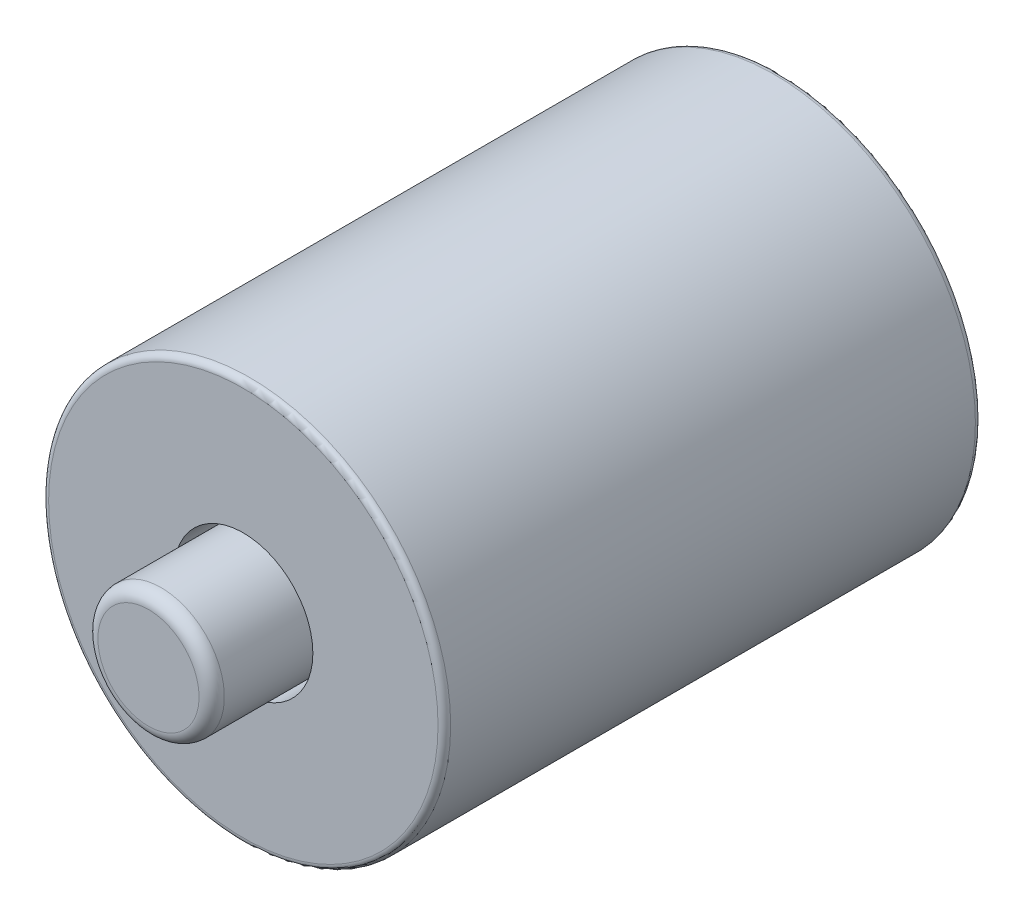
ISO-10303-21;
HEADER;
FILE_DESCRIPTION(('STEP AP214'),'2;1');
FILE_NAME('part.step','',(''),(''),'','','');
FILE_SCHEMA(('AUTOMOTIVE_DESIGN { 1 0 10303 214 1 1 1 1 }'));
ENDSEC;
DATA;
#1=APPLICATION_CONTEXT('core data for automotive mechanical design processes');
#2=APPLICATION_PROTOCOL_DEFINITION('international standard','automotive_design',2000,#1);
#3=PRODUCT_CONTEXT('',#1,'mechanical');
#4=PRODUCT('Part','Part','',(#3));
#5=PRODUCT_RELATED_PRODUCT_CATEGORY('part','',(#4));
#6=PRODUCT_DEFINITION_FORMATION('','',#4);
#7=PRODUCT_DEFINITION_CONTEXT('part definition',#1,'design');
#8=PRODUCT_DEFINITION('design','',#6,#7);
#9=PRODUCT_DEFINITION_SHAPE('','',#8);
#10=(LENGTH_UNIT() NAMED_UNIT(*) SI_UNIT(.MILLI.,.METRE.));
#11=(NAMED_UNIT(*) PLANE_ANGLE_UNIT() SI_UNIT($,.RADIAN.));
#12=(NAMED_UNIT(*) SI_UNIT($,.STERADIAN.) SOLID_ANGLE_UNIT());
#13=UNCERTAINTY_MEASURE_WITH_UNIT(LENGTH_MEASURE(1.E-05),#10,'distance_accuracy_value','');
#14=(GEOMETRIC_REPRESENTATION_CONTEXT(3) GLOBAL_UNCERTAINTY_ASSIGNED_CONTEXT((#13)) GLOBAL_UNIT_ASSIGNED_CONTEXT((#10,
#11,#12)) REPRESENTATION_CONTEXT('',''));
#15=CARTESIAN_POINT('',(0.,0.,0.));
#16=DIRECTION('',(0.,0.,1.));
#17=DIRECTION('',(1.,0.,0.));
#18=AXIS2_PLACEMENT_3D('',#15,#16,#17);
#19=CARTESIAN_POINT('',(0.,0.,10.));
#20=DIRECTION('',(0.,0.,-1.));
#21=DIRECTION('',(-1.,0.,0.));
#22=AXIS2_PLACEMENT_3D('',#19,#20,#21);
#23=CYLINDRICAL_SURFACE('',#22,1.);
#24=CARTESIAN_POINT('',(0.,0.,9.8));
#25=DIRECTION('',(0.,0.,-1.));
#26=DIRECTION('',(-1.,0.,0.));
#27=AXIS2_PLACEMENT_3D('',#24,#25,#26);
#28=CIRCLE('',#27,1.);
#29=CARTESIAN_POINT('',(-1.,0.,9.8));
#30=VERTEX_POINT('',#29);
#31=EDGE_CURVE('E45',#30,#30,#28,.T.);
#32=ORIENTED_EDGE('',*,*,#31,.T.);
#33=EDGE_LOOP('',(#32));
#34=FACE_BOUND('',#33,.T.);
#35=CARTESIAN_POINT('',(0.,0.,0.));
#36=DIRECTION('',(0.,0.,-1.));
#37=DIRECTION('',(-1.,0.,0.));
#38=AXIS2_PLACEMENT_3D('',#35,#36,#37);
#39=CIRCLE('',#38,1.);
#40=CARTESIAN_POINT('',(-1.,0.,0.));
#41=VERTEX_POINT('',#40);
#42=EDGE_CURVE('E49',#41,#41,#39,.T.);
#43=ORIENTED_EDGE('',*,*,#42,.F.);
#44=EDGE_LOOP('',(#43));
#45=FACE_BOUND('',#44,.T.);
#46=ADVANCED_FACE('F38',(#34,#45),#23,.T.);
#47=CARTESIAN_POINT('',(0.,0.,10.));
#48=DIRECTION('',(0.,0.,-1.));
#49=DIRECTION('',(-1.,0.,0.));
#50=AXIS2_PLACEMENT_3D('',#47,#48,#49);
#51=PLANE('',#50);
#52=CARTESIAN_POINT('',(0.,0.,10.));
#53=DIRECTION('',(0.,0.,-1.));
#54=DIRECTION('',(-1.,0.,0.));
#55=AXIS2_PLACEMENT_3D('',#52,#53,#54);
#56=CIRCLE('',#55,0.8);
#57=CARTESIAN_POINT('',(-0.8,0.,10.));
#58=VERTEX_POINT('',#57);
#59=EDGE_CURVE('E11',#58,#58,#56,.F.);
#60=ORIENTED_EDGE('',*,*,#59,.T.);
#61=EDGE_LOOP('',(#60));
#62=FACE_BOUND('',#61,.T.);
#63=ADVANCED_FACE('F59',(#62),#51,.F.);
#64=CARTESIAN_POINT('',(0.,0.,0.));
#65=DIRECTION('',(0.,0.,-1.));
#66=DIRECTION('',(-1.,0.,0.));
#67=AXIS2_PLACEMENT_3D('',#64,#65,#66);
#68=PLANE('',#67);
#69=ORIENTED_EDGE('',*,*,#42,.T.);
#70=EDGE_LOOP('',(#69));
#71=FACE_BOUND('',#70,.T.);
#72=ADVANCED_FACE('F56',(#71),#68,.T.);
#73=CARTESIAN_POINT('',(0.,0.,9.8));
#74=DIRECTION('',(0.,0.,-1.));
#75=DIRECTION('',(-1.,0.,0.));
#76=AXIS2_PLACEMENT_3D('',#73,#74,#75);
#77=TOROIDAL_SURFACE('',#76,0.8,0.2);
#78=ORIENTED_EDGE('',*,*,#59,.F.);
#79=EDGE_LOOP('',(#78));
#80=FACE_BOUND('',#79,.T.);
#81=ORIENTED_EDGE('',*,*,#31,.F.);
#82=EDGE_LOOP('',(#81));
#83=FACE_BOUND('',#82,.T.);
#84=ADVANCED_FACE('F40',(#80,#83),#77,.T.);
#85=CLOSED_SHELL('',(#46,#63,#72,#84));
#86=MANIFOLD_SOLID_BREP('B2',#85);
#87=CARTESIAN_POINT('',(0.,0.,8.5));
#88=DIRECTION('',(0.,0.,-1.));
#89=DIRECTION('',(-1.,0.,0.));
#90=AXIS2_PLACEMENT_3D('',#87,#88,#89);
#91=CYLINDRICAL_SURFACE('',#90,3.18);
#92=CARTESIAN_POINT('',(0.,0.,0.0999999999999994));
#93=DIRECTION('',(0.,0.,1.));
#94=DIRECTION('',(1.,0.,0.));
#95=AXIS2_PLACEMENT_3D('',#92,#93,#94);
#96=CIRCLE('',#95,3.18);
#97=CARTESIAN_POINT('',(3.18,0.,0.0999999999999994));
#98=VERTEX_POINT('',#97);
#99=EDGE_CURVE('E101',#98,#98,#96,.T.);
#100=ORIENTED_EDGE('',*,*,#99,.T.);
#101=EDGE_LOOP('',(#100));
#102=FACE_BOUND('',#101,.T.);
#103=CARTESIAN_POINT('',(0.,0.,8.4));
#104=DIRECTION('',(0.,0.,1.));
#105=DIRECTION('',(1.,0.,0.));
#106=AXIS2_PLACEMENT_3D('',#103,#104,#105);
#107=CIRCLE('',#106,3.18);
#108=CARTESIAN_POINT('',(3.18,0.,8.4));
#109=VERTEX_POINT('',#108);
#110=EDGE_CURVE('E105',#109,#109,#107,.F.);
#111=ORIENTED_EDGE('',*,*,#110,.T.);
#112=EDGE_LOOP('',(#111));
#113=FACE_BOUND('',#112,.T.);
#114=ADVANCED_FACE('F94',(#102,#113),#91,.T.);
#115=CARTESIAN_POINT('',(0.,0.,8.5));
#116=DIRECTION('',(0.,0.,1.));
#117=DIRECTION('',(1.,0.,0.));
#118=AXIS2_PLACEMENT_3D('',#115,#116,#117);
#119=PLANE('',#118);
#120=CARTESIAN_POINT('',(0.,0.,8.5));
#121=DIRECTION('',(0.,0.,1.));
#122=DIRECTION('',(1.,0.,0.));
#123=AXIS2_PLACEMENT_3D('',#120,#121,#122);
#124=CIRCLE('',#123,3.08);
#125=CARTESIAN_POINT('',(3.08,0.,8.5));
#126=VERTEX_POINT('',#125);
#127=EDGE_CURVE('E109',#126,#126,#124,.T.);
#128=ORIENTED_EDGE('',*,*,#127,.T.);
#129=EDGE_LOOP('',(#128));
#130=FACE_BOUND('',#129,.T.);
#131=CARTESIAN_POINT('',(0.,0.,8.5));
#132=DIRECTION('',(0.,0.,1.));
#133=DIRECTION('',(1.,0.,0.));
#134=AXIS2_PLACEMENT_3D('',#131,#132,#133);
#135=CIRCLE('',#134,1.1);
#136=CARTESIAN_POINT('',(1.1,0.,8.5));
#137=VERTEX_POINT('',#136);
#138=EDGE_CURVE('E114',#137,#137,#135,.T.);
#139=ORIENTED_EDGE('',*,*,#138,.F.);
#140=EDGE_LOOP('',(#139));
#141=FACE_BOUND('',#140,.T.);
#142=ADVANCED_FACE('F133',(#130,#141),#119,.T.);
#143=CARTESIAN_POINT('',(0.,0.,0.));
#144=DIRECTION('',(0.,0.,1.));
#145=DIRECTION('',(1.,0.,0.));
#146=AXIS2_PLACEMENT_3D('',#143,#144,#145);
#147=PLANE('',#146);
#148=CARTESIAN_POINT('',(0.,0.,0.));
#149=DIRECTION('',(0.,0.,1.));
#150=DIRECTION('',(1.,0.,0.));
#151=AXIS2_PLACEMENT_3D('',#148,#149,#150);
#152=CIRCLE('',#151,3.08);
#153=CARTESIAN_POINT('',(3.08,0.,0.));
#154=VERTEX_POINT('',#153);
#155=EDGE_CURVE('E37',#154,#154,#152,.F.);
#156=ORIENTED_EDGE('',*,*,#155,.T.);
#157=EDGE_LOOP('',(#156));
#158=FACE_BOUND('',#157,.T.);
#159=CARTESIAN_POINT('',(0.,0.,0.));
#160=DIRECTION('',(0.,0.,1.));
#161=DIRECTION('',(1.,0.,0.));
#162=AXIS2_PLACEMENT_3D('',#159,#160,#161);
#163=CIRCLE('',#162,1.1);
#164=CARTESIAN_POINT('',(1.1,0.,0.));
#165=VERTEX_POINT('',#164);
#166=EDGE_CURVE('E117',#165,#165,#163,.T.);
#167=ORIENTED_EDGE('',*,*,#166,.T.);
#168=EDGE_LOOP('',(#167));
#169=FACE_BOUND('',#168,.T.);
#170=ADVANCED_FACE('F121',(#158,#169),#147,.F.);
#171=CARTESIAN_POINT('',(0.,0.,0.));
#172=DIRECTION('',(0.,0.,1.));
#173=DIRECTION('',(1.,0.,0.));
#174=AXIS2_PLACEMENT_3D('',#171,#172,#173);
#175=CYLINDRICAL_SURFACE('',#174,1.1);
#176=ORIENTED_EDGE('',*,*,#138,.T.);
#177=EDGE_LOOP('',(#176));
#178=FACE_BOUND('',#177,.T.);
#179=ORIENTED_EDGE('',*,*,#166,.F.);
#180=EDGE_LOOP('',(#179));
#181=FACE_BOUND('',#180,.T.);
#182=ADVANCED_FACE('F123',(#178,#181),#175,.F.);
#183=CARTESIAN_POINT('',(0.,0.,8.4));
#184=DIRECTION('',(0.,0.,1.));
#185=DIRECTION('',(1.,0.,0.));
#186=AXIS2_PLACEMENT_3D('',#183,#184,#185);
#187=TOROIDAL_SURFACE('',#186,3.08,0.1);
#188=ORIENTED_EDGE('',*,*,#110,.F.);
#189=EDGE_LOOP('',(#188));
#190=FACE_BOUND('',#189,.T.);
#191=ORIENTED_EDGE('',*,*,#127,.F.);
#192=EDGE_LOOP('',(#191));
#193=FACE_BOUND('',#192,.T.);
#194=ADVANCED_FACE('F125',(#190,#193),#187,.T.);
#195=CARTESIAN_POINT('',(0.,0.,0.0999999999999994));
#196=DIRECTION('',(0.,0.,1.));
#197=DIRECTION('',(1.,0.,0.));
#198=AXIS2_PLACEMENT_3D('',#195,#196,#197);
#199=TOROIDAL_SURFACE('',#198,3.08,0.1);
#200=ORIENTED_EDGE('',*,*,#155,.F.);
#201=EDGE_LOOP('',(#200));
#202=FACE_BOUND('',#201,.T.);
#203=ORIENTED_EDGE('',*,*,#99,.F.);
#204=EDGE_LOOP('',(#203));
#205=FACE_BOUND('',#204,.T.);
#206=ADVANCED_FACE('F96',(#202,#205),#199,.T.);
#207=CLOSED_SHELL('',(#114,#142,#170,#182,#194,#206));
#208=MANIFOLD_SOLID_BREP('B6',#207);
#209=ADVANCED_BREP_SHAPE_REPRESENTATION('',(#18,#86,#208),#14);
#210=SHAPE_DEFINITION_REPRESENTATION(#9,#209);
ENDSEC;
END-ISO-10303-21;
